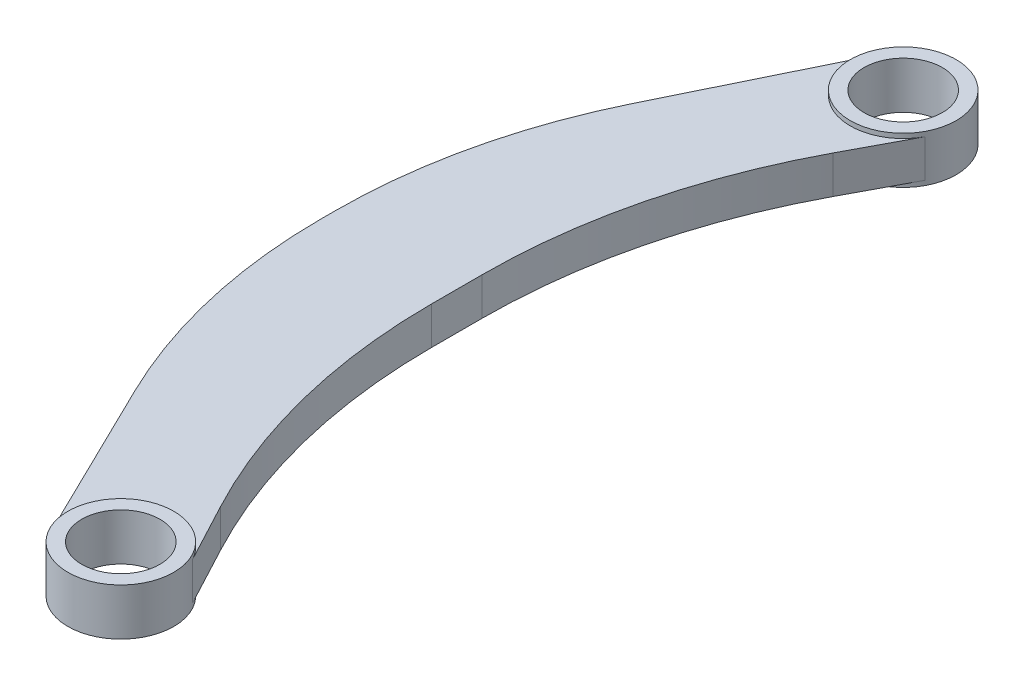
ISO-10303-21;
HEADER;
FILE_DESCRIPTION(('STEP AP214'),'2;1');
FILE_NAME('part.step','',(''),(''),'','','');
FILE_SCHEMA(('AUTOMOTIVE_DESIGN { 1 0 10303 214 1 1 1 1 }'));
ENDSEC;
DATA;
#1=APPLICATION_CONTEXT('core data for automotive mechanical design processes');
#2=APPLICATION_PROTOCOL_DEFINITION('international standard','automotive_design',2000,#1);
#3=PRODUCT_CONTEXT('',#1,'mechanical');
#4=PRODUCT('Part','Part','',(#3));
#5=PRODUCT_RELATED_PRODUCT_CATEGORY('part','',(#4));
#6=PRODUCT_DEFINITION_FORMATION('','',#4);
#7=PRODUCT_DEFINITION_CONTEXT('part definition',#1,'design');
#8=PRODUCT_DEFINITION('design','',#6,#7);
#9=PRODUCT_DEFINITION_SHAPE('','',#8);
#10=(LENGTH_UNIT() NAMED_UNIT(*) SI_UNIT(.MILLI.,.METRE.));
#11=(NAMED_UNIT(*) PLANE_ANGLE_UNIT() SI_UNIT($,.RADIAN.));
#12=(NAMED_UNIT(*) SI_UNIT($,.STERADIAN.) SOLID_ANGLE_UNIT());
#13=UNCERTAINTY_MEASURE_WITH_UNIT(LENGTH_MEASURE(1.E-05),#10,'distance_accuracy_value','');
#14=(GEOMETRIC_REPRESENTATION_CONTEXT(3) GLOBAL_UNCERTAINTY_ASSIGNED_CONTEXT((#13)) GLOBAL_UNIT_ASSIGNED_CONTEXT((#10,
#11,#12)) REPRESENTATION_CONTEXT('',''));
#15=CARTESIAN_POINT('',(0.,0.,0.));
#16=DIRECTION('',(0.,0.,1.));
#17=DIRECTION('',(1.,0.,0.));
#18=AXIS2_PLACEMENT_3D('',#15,#16,#17);
#19=CARTESIAN_POINT('',(-300.00000000003,421.,1299.99999999994));
#20=DIRECTION('',(0.,-1.,0.));
#21=DIRECTION('',(0.,0.,-1.));
#22=AXIS2_PLACEMENT_3D('',#19,#20,#21);
#23=PLANE('',#22);
#24=CARTESIAN_POINT('',(-300.00000000003,421.,1299.99999999994));
#25=DIRECTION('',(0.,-1.,0.));
#26=DIRECTION('',(0.438371146789078,0.,-0.898794046299167));
#27=AXIS2_PLACEMENT_3D('',#24,#25,#26);
#28=CIRCLE('',#27,115.000000000002);
#29=CARTESIAN_POINT('',(-249.587318119285,421.,1196.63868467554));
#30=VERTEX_POINT('',#29);
#31=EDGE_CURVE('E148',#30,#30,#28,.T.);
#32=ORIENTED_EDGE('',*,*,#31,.F.);
#33=EDGE_LOOP('',(#32));
#34=FACE_BOUND('',#33,.T.);
#35=CARTESIAN_POINT('',(-300.00000000003,421.,1299.99999999994));
#36=DIRECTION('',(0.,-1.,0.));
#37=DIRECTION('',(1.,0.,0.));
#38=AXIS2_PLACEMENT_3D('',#35,#36,#37);
#39=CIRCLE('',#38,85.0000000000018);
#40=CARTESIAN_POINT('',(-215.000000000029,421.,1299.99999999994));
#41=VERTEX_POINT('',#40);
#42=EDGE_CURVE('E271',#41,#41,#39,.F.);
#43=ORIENTED_EDGE('',*,*,#42,.F.);
#44=EDGE_LOOP('',(#43));
#45=FACE_BOUND('',#44,.T.);
#46=ADVANCED_FACE('F16',(#34,#45),#23,.F.);
#47=CARTESIAN_POINT('',(-300.00000000003,319.,1299.99999999994));
#48=DIRECTION('',(0.,1.,0.));
#49=DIRECTION('',(0.,0.,1.));
#50=AXIS2_PLACEMENT_3D('',#47,#48,#49);
#51=PLANE('',#50);
#52=CARTESIAN_POINT('',(-300.00000000003,319.,1299.99999999994));
#53=DIRECTION('',(0.,1.,0.));
#54=DIRECTION('',(0.438371146789078,0.,-0.898794046299167));
#55=AXIS2_PLACEMENT_3D('',#52,#53,#54);
#56=CIRCLE('',#55,115.000000000002);
#57=CARTESIAN_POINT('',(-249.587318119285,319.,1196.63868467554));
#58=VERTEX_POINT('',#57);
#59=EDGE_CURVE('E116',#58,#58,#56,.T.);
#60=ORIENTED_EDGE('',*,*,#59,.F.);
#61=EDGE_LOOP('',(#60));
#62=FACE_BOUND('',#61,.T.);
#63=CARTESIAN_POINT('',(-300.00000000003,319.,1299.99999999994));
#64=DIRECTION('',(0.,1.,0.));
#65=DIRECTION('',(-1.,0.,0.));
#66=AXIS2_PLACEMENT_3D('',#63,#64,#65);
#67=CIRCLE('',#66,85.0000000000018);
#68=CARTESIAN_POINT('',(-385.000000000032,319.,1299.99999999994));
#69=VERTEX_POINT('',#68);
#70=EDGE_CURVE('E277',#69,#69,#67,.F.);
#71=ORIENTED_EDGE('',*,*,#70,.F.);
#72=EDGE_LOOP('',(#71));
#73=FACE_BOUND('',#72,.T.);
#74=ADVANCED_FACE('F284',(#62,#73),#51,.F.);
#75=CARTESIAN_POINT('',(-300.00000000003,421.,3000.));
#76=DIRECTION('',(0.,-1.,0.));
#77=DIRECTION('',(0.,0.,-1.));
#78=AXIS2_PLACEMENT_3D('',#75,#76,#77);
#79=PLANE('',#78);
#80=CARTESIAN_POINT('',(-300.00000000003,421.,3000.));
#81=DIRECTION('',(0.,-1.,0.));
#82=DIRECTION('',(0.438371146789078,0.,-0.898794046299167));
#83=AXIS2_PLACEMENT_3D('',#80,#81,#82);
#84=CIRCLE('',#83,115.000000000002);
#85=CARTESIAN_POINT('',(-249.587318119285,421.,2896.63868467559));
#86=VERTEX_POINT('',#85);
#87=EDGE_CURVE('E149',#86,#86,#84,.T.);
#88=ORIENTED_EDGE('',*,*,#87,.F.);
#89=EDGE_LOOP('',(#88));
#90=FACE_BOUND('',#89,.T.);
#91=CARTESIAN_POINT('',(-300.00000000003,421.,3000.));
#92=DIRECTION('',(0.,-1.,0.));
#93=DIRECTION('',(1.,0.,0.));
#94=AXIS2_PLACEMENT_3D('',#91,#92,#93);
#95=CIRCLE('',#94,85.000000000002);
#96=CARTESIAN_POINT('',(-215.000000000028,421.,3000.));
#97=VERTEX_POINT('',#96);
#98=EDGE_CURVE('E117',#97,#97,#95,.F.);
#99=ORIENTED_EDGE('',*,*,#98,.F.);
#100=EDGE_LOOP('',(#99));
#101=FACE_BOUND('',#100,.T.);
#102=ADVANCED_FACE('F286',(#90,#101),#79,.F.);
#103=CARTESIAN_POINT('',(-300.00000000003,319.,3000.));
#104=DIRECTION('',(0.,1.,0.));
#105=DIRECTION('',(0.,0.,1.));
#106=AXIS2_PLACEMENT_3D('',#103,#104,#105);
#107=PLANE('',#106);
#108=CARTESIAN_POINT('',(-300.00000000003,319.,3000.));
#109=DIRECTION('',(0.,1.,0.));
#110=DIRECTION('',(0.438371146789078,0.,-0.898794046299167));
#111=AXIS2_PLACEMENT_3D('',#108,#109,#110);
#112=CIRCLE('',#111,115.000000000002);
#113=CARTESIAN_POINT('',(-249.587318119285,319.,2896.63868467559));
#114=VERTEX_POINT('',#113);
#115=EDGE_CURVE('E260',#114,#114,#112,.T.);
#116=ORIENTED_EDGE('',*,*,#115,.F.);
#117=EDGE_LOOP('',(#116));
#118=FACE_BOUND('',#117,.T.);
#119=CARTESIAN_POINT('',(-300.00000000003,319.,3000.));
#120=DIRECTION('',(0.,1.,0.));
#121=DIRECTION('',(-1.,0.,0.));
#122=AXIS2_PLACEMENT_3D('',#119,#120,#121);
#123=CIRCLE('',#122,85.000000000002);
#124=CARTESIAN_POINT('',(-385.000000000032,319.,3000.));
#125=VERTEX_POINT('',#124);
#126=EDGE_CURVE('E274',#125,#125,#123,.F.);
#127=ORIENTED_EDGE('',*,*,#126,.F.);
#128=EDGE_LOOP('',(#127));
#129=FACE_BOUND('',#128,.T.);
#130=ADVANCED_FACE('F294',(#118,#129),#107,.F.);
#131=CARTESIAN_POINT('',(-300.00000000003,411.,3000.));
#132=DIRECTION('',(0.,1.,0.));
#133=DIRECTION('',(0.,0.,1.));
#134=AXIS2_PLACEMENT_3D('',#131,#132,#133);
#135=PLANE('',#134);
#136=DIRECTION('',(-0.438371146789078,0.,0.898794046299167));
#137=VECTOR('',#136,1.);
#138=CARTESIAN_POINT('',(-403.361315324436,411.,1249.5873181192));
#139=LINE('',#138,#137);
#140=CARTESIAN_POINT('',(-403.361315324436,411.,1249.5873181192));
#141=VERTEX_POINT('',#140);
#142=CARTESIAN_POINT('',(-578.552855559036,411.,1608.78320607439));
#143=VERTEX_POINT('',#142);
#144=EDGE_CURVE('E121',#141,#143,#139,.T.);
#145=ORIENTED_EDGE('',*,*,#144,.T.);
#146=CARTESIAN_POINT('',(499.999999999986,411.,2134.82858222129));
#147=DIRECTION('',(0.,1.,0.));
#148=DIRECTION('',(0.,0.,1.));
#149=AXIS2_PLACEMENT_3D('',#146,#147,#148);
#150=CIRCLE('',#149,1200.00000000002);
#151=CARTESIAN_POINT('',(-700.000000000038,411.,2134.82858222129));
#152=VERTEX_POINT('',#151);
#153=EDGE_CURVE('E10',#143,#152,#150,.T.);
#154=ORIENTED_EDGE('',*,*,#153,.T.);
#155=DIRECTION('',(0.,0.,1.));
#156=VECTOR('',#155,1.);
#157=CARTESIAN_POINT('',(-700.000000000038,411.,1857.78675287061));
#158=LINE('',#157,#156);
#159=CARTESIAN_POINT('',(-700.000000000038,411.,2165.17141777862));
#160=VERTEX_POINT('',#159);
#161=EDGE_CURVE('E158',#152,#160,#158,.T.);
#162=ORIENTED_EDGE('',*,*,#161,.T.);
#163=CARTESIAN_POINT('',(499.999999999986,411.,2165.17141777862));
#164=DIRECTION('',(0.,1.,0.));
#165=DIRECTION('',(0.,0.,1.));
#166=AXIS2_PLACEMENT_3D('',#163,#164,#165);
#167=CIRCLE('',#166,1200.00000000002);
#168=CARTESIAN_POINT('',(-578.552855559036,411.,2691.21679392553));
#169=VERTEX_POINT('',#168);
#170=EDGE_CURVE('E228',#160,#169,#167,.T.);
#171=ORIENTED_EDGE('',*,*,#170,.T.);
#172=DIRECTION('',(0.438371146789078,0.,0.898794046299167));
#173=VECTOR('',#172,1.);
#174=CARTESIAN_POINT('',(-700.000000000038,411.,2442.21324712931));
#175=LINE('',#174,#173);
#176=CARTESIAN_POINT('',(-403.361315324436,411.,3050.41268188072));
#177=VERTEX_POINT('',#176);
#178=EDGE_CURVE('E160',#169,#177,#175,.T.);
#179=ORIENTED_EDGE('',*,*,#178,.T.);
#180=CARTESIAN_POINT('',(-300.00000000003,411.,3000.));
#181=DIRECTION('',(0.,-1.,0.));
#182=DIRECTION('',(0.438371146789078,0.,-0.898794046299167));
#183=AXIS2_PLACEMENT_3D('',#180,#181,#182);
#184=CIRCLE('',#183,115.000000000002);
#185=CARTESIAN_POINT('',(-198.461026821251,411.,2946.0107702796));
#186=VERTEX_POINT('',#185);
#187=EDGE_CURVE('E255',#177,#186,#184,.T.);
#188=ORIENTED_EDGE('',*,*,#187,.T.);
#189=DIRECTION('',(-0.469471562785891,0.,-0.882947592858927));
#190=VECTOR('',#189,1.);
#191=CARTESIAN_POINT('',(-198.461026821251,411.,2946.0107702796));
#192=LINE('',#191,#190);
#193=CARTESIAN_POINT('',(-267.831870716634,411.,2815.54318824215));
#194=VERTEX_POINT('',#193);
#195=EDGE_CURVE('E151',#186,#194,#192,.T.);
#196=ORIENTED_EDGE('',*,*,#195,.T.);
#197=CARTESIAN_POINT('',(880.,411.,2205.23015662047));
#198=DIRECTION('',(0.,1.,0.));
#199=DIRECTION('',(0.,0.,1.));
#200=AXIS2_PLACEMENT_3D('',#197,#198,#199);
#201=CIRCLE('',#200,1300.00000000003);
#202=CARTESIAN_POINT('',(-420.000000000032,411.,2205.23015662047));
#203=VERTEX_POINT('',#202);
#204=EDGE_CURVE('E194',#194,#203,#201,.F.);
#205=ORIENTED_EDGE('',*,*,#204,.T.);
#206=DIRECTION('',(0.,0.,-1.));
#207=VECTOR('',#206,1.);
#208=CARTESIAN_POINT('',(-420.000000000032,411.,2529.35656031662));
#209=LINE('',#208,#207);
#210=CARTESIAN_POINT('',(-420.000000000032,411.,2094.76984337945));
#211=VERTEX_POINT('',#210);
#212=EDGE_CURVE('E154',#203,#211,#209,.T.);
#213=ORIENTED_EDGE('',*,*,#212,.T.);
#214=CARTESIAN_POINT('',(880.,411.,2094.76984337945));
#215=DIRECTION('',(0.,1.,0.));
#216=DIRECTION('',(0.,0.,1.));
#217=AXIS2_PLACEMENT_3D('',#214,#215,#216);
#218=CIRCLE('',#217,1300.00000000003);
#219=CARTESIAN_POINT('',(-267.831870716634,411.,1484.45681175778));
#220=VERTEX_POINT('',#219);
#221=EDGE_CURVE('E217',#211,#220,#218,.F.);
#222=ORIENTED_EDGE('',*,*,#221,.T.);
#223=DIRECTION('',(0.469471562785891,0.,-0.882947592858927));
#224=VECTOR('',#223,1.);
#225=CARTESIAN_POINT('',(-420.000000000032,411.,1770.64343968331));
#226=LINE('',#225,#224);
#227=CARTESIAN_POINT('',(-198.461026821251,411.,1353.98922972032));
#228=VERTEX_POINT('',#227);
#229=EDGE_CURVE('E157',#220,#228,#226,.T.);
#230=ORIENTED_EDGE('',*,*,#229,.T.);
#231=CARTESIAN_POINT('',(-300.00000000003,411.,1299.99999999994));
#232=DIRECTION('',(0.,-1.,0.));
#233=DIRECTION('',(0.438371146789078,0.,-0.898794046299167));
#234=AXIS2_PLACEMENT_3D('',#231,#232,#233);
#235=CIRCLE('',#234,115.000000000002);
#236=EDGE_CURVE('E144',#228,#141,#235,.T.);
#237=ORIENTED_EDGE('',*,*,#236,.T.);
#238=EDGE_LOOP('',(#145,#154,#162,#171,#179,#188,#196,#205,#213,#222,#230,#237));
#239=FACE_BOUND('',#238,.T.);
#240=ADVANCED_FACE('F247',(#239),#135,.T.);
#241=CARTESIAN_POINT('',(-300.00000000003,411.,3000.));
#242=DIRECTION('',(0.,-1.,0.));
#243=DIRECTION('',(0.,0.,-1.));
#244=AXIS2_PLACEMENT_3D('',#241,#242,#243);
#245=CYLINDRICAL_SURFACE('',#244,115.000000000002);
#246=DIRECTION('',(0.,-1.,0.));
#247=VECTOR('',#246,1.);
#248=CARTESIAN_POINT('',(-403.361315324436,411.,3050.41268188072));
#249=LINE('',#248,#247);
#250=CARTESIAN_POINT('',(-403.361315324436,329.,3050.41268188072));
#251=VERTEX_POINT('',#250);
#252=EDGE_CURVE('E122',#177,#251,#249,.T.);
#253=ORIENTED_EDGE('',*,*,#252,.T.);
#254=CARTESIAN_POINT('',(-300.00000000003,329.,3000.));
#255=DIRECTION('',(0.,1.,0.));
#256=DIRECTION('',(0.438371146789078,0.,-0.898794046299167));
#257=AXIS2_PLACEMENT_3D('',#254,#255,#256);
#258=CIRCLE('',#257,115.000000000002);
#259=CARTESIAN_POINT('',(-198.461026821251,329.,2946.0107702796));
#260=VERTEX_POINT('',#259);
#261=EDGE_CURVE('E185',#260,#251,#258,.T.);
#262=ORIENTED_EDGE('',*,*,#261,.F.);
#263=DIRECTION('',(0.,-1.,0.));
#264=VECTOR('',#263,1.);
#265=CARTESIAN_POINT('',(-198.461026821251,411.,2946.0107702796));
#266=LINE('',#265,#264);
#267=EDGE_CURVE('E183',#186,#260,#266,.T.);
#268=ORIENTED_EDGE('',*,*,#267,.F.);
#269=ORIENTED_EDGE('',*,*,#187,.F.);
#270=EDGE_LOOP('',(#253,#262,#268,#269));
#271=FACE_BOUND('',#270,.T.);
#272=ORIENTED_EDGE('',*,*,#87,.T.);
#273=EDGE_LOOP('',(#272));
#274=FACE_BOUND('',#273,.T.);
#275=ORIENTED_EDGE('',*,*,#115,.T.);
#276=EDGE_LOOP('',(#275));
#277=FACE_BOUND('',#276,.T.);
#278=ADVANCED_FACE('F256',(#271,#274,#277),#245,.T.);
#279=CARTESIAN_POINT('',(-198.461026821251,411.,2946.0107702796));
#280=DIRECTION('',(-0.882947592858927,0.,0.469471562785891));
#281=DIRECTION('',(0.469471562785891,0.,0.882947592858927));
#282=AXIS2_PLACEMENT_3D('',#279,#280,#281);
#283=PLANE('',#282);
#284=DIRECTION('',(-0.469471562785891,0.,-0.882947592858927));
#285=VECTOR('',#284,1.);
#286=CARTESIAN_POINT('',(-198.461026821251,329.,2946.0107702796));
#287=LINE('',#286,#285);
#288=CARTESIAN_POINT('',(-267.831870716634,329.,2815.54318824215));
#289=VERTEX_POINT('',#288);
#290=EDGE_CURVE('E163',#260,#289,#287,.T.);
#291=ORIENTED_EDGE('',*,*,#290,.T.);
#292=DIRECTION('',(0.,-1.,0.));
#293=VECTOR('',#292,1.);
#294=CARTESIAN_POINT('',(-267.831870716634,411.,2815.54318824215));
#295=LINE('',#294,#293);
#296=EDGE_CURVE('E190',#289,#194,#295,.F.);
#297=ORIENTED_EDGE('',*,*,#296,.T.);
#298=ORIENTED_EDGE('',*,*,#195,.F.);
#299=ORIENTED_EDGE('',*,*,#267,.T.);
#300=EDGE_LOOP('',(#291,#297,#298,#299));
#301=FACE_BOUND('',#300,.T.);
#302=ADVANCED_FACE('F326',(#301),#283,.F.);
#303=CARTESIAN_POINT('',(-420.000000000032,411.,2529.35656031662));
#304=DIRECTION('',(-1.,0.,0.));
#305=DIRECTION('',(0.,0.,1.));
#306=AXIS2_PLACEMENT_3D('',#303,#304,#305);
#307=PLANE('',#306);
#308=DIRECTION('',(0.,0.,-1.));
#309=VECTOR('',#308,1.);
#310=CARTESIAN_POINT('',(-420.000000000032,329.,2529.35656031662));
#311=LINE('',#310,#309);
#312=CARTESIAN_POINT('',(-420.000000000032,329.,2205.23015662047));
#313=VERTEX_POINT('',#312);
#314=CARTESIAN_POINT('',(-420.000000000032,329.,2094.76984337945));
#315=VERTEX_POINT('',#314);
#316=EDGE_CURVE('E136',#313,#315,#311,.T.);
#317=ORIENTED_EDGE('',*,*,#316,.T.);
#318=DIRECTION('',(0.,-1.,0.));
#319=VECTOR('',#318,1.);
#320=CARTESIAN_POINT('',(-420.000000000032,411.,2094.76984337945));
#321=LINE('',#320,#319);
#322=EDGE_CURVE('E349',#315,#211,#321,.F.);
#323=ORIENTED_EDGE('',*,*,#322,.T.);
#324=ORIENTED_EDGE('',*,*,#212,.F.);
#325=DIRECTION('',(0.,-1.,0.));
#326=VECTOR('',#325,1.);
#327=CARTESIAN_POINT('',(-420.000000000032,329.,2205.23015662047));
#328=LINE('',#327,#326);
#329=EDGE_CURVE('E188',#203,#313,#328,.T.);
#330=ORIENTED_EDGE('',*,*,#329,.T.);
#331=EDGE_LOOP('',(#317,#323,#324,#330));
#332=FACE_BOUND('',#331,.T.);
#333=ADVANCED_FACE('F322',(#332),#307,.F.);
#334=CARTESIAN_POINT('',(-420.000000000032,411.,1770.64343968331));
#335=DIRECTION('',(-0.882947592858927,0.,-0.469471562785891));
#336=DIRECTION('',(-0.469471562785891,0.,0.882947592858927));
#337=AXIS2_PLACEMENT_3D('',#334,#335,#336);
#338=PLANE('',#337);
#339=ORIENTED_EDGE('',*,*,#229,.F.);
#340=DIRECTION('',(0.,-1.,0.));
#341=VECTOR('',#340,1.);
#342=CARTESIAN_POINT('',(-267.831870716634,329.,1484.45681175778));
#343=LINE('',#342,#341);
#344=CARTESIAN_POINT('',(-267.831870716634,329.,1484.45681175778));
#345=VERTEX_POINT('',#344);
#346=EDGE_CURVE('E196',#220,#345,#343,.T.);
#347=ORIENTED_EDGE('',*,*,#346,.T.);
#348=DIRECTION('',(0.469471562785891,0.,-0.882947592858927));
#349=VECTOR('',#348,1.);
#350=CARTESIAN_POINT('',(-420.000000000032,329.,1770.64343968331));
#351=LINE('',#350,#349);
#352=CARTESIAN_POINT('',(-198.461026821251,329.,1353.98922972032));
#353=VERTEX_POINT('',#352);
#354=EDGE_CURVE('E127',#345,#353,#351,.T.);
#355=ORIENTED_EDGE('',*,*,#354,.T.);
#356=DIRECTION('',(0.,-1.,0.));
#357=VECTOR('',#356,1.);
#358=CARTESIAN_POINT('',(-198.461026821251,411.,1353.98922972032));
#359=LINE('',#358,#357);
#360=EDGE_CURVE('E113',#228,#353,#359,.T.);
#361=ORIENTED_EDGE('',*,*,#360,.F.);
#362=EDGE_LOOP('',(#339,#347,#355,#361));
#363=FACE_BOUND('',#362,.T.);
#364=ADVANCED_FACE('F319',(#363),#338,.F.);
#365=CARTESIAN_POINT('',(-300.00000000003,411.,1299.99999999994));
#366=DIRECTION('',(0.,-1.,0.));
#367=DIRECTION('',(0.,0.,-1.));
#368=AXIS2_PLACEMENT_3D('',#365,#366,#367);
#369=CYLINDRICAL_SURFACE('',#368,115.000000000002);
#370=ORIENTED_EDGE('',*,*,#360,.T.);
#371=CARTESIAN_POINT('',(-300.00000000003,329.,1299.99999999994));
#372=DIRECTION('',(0.,1.,0.));
#373=DIRECTION('',(0.438371146789078,0.,-0.898794046299167));
#374=AXIS2_PLACEMENT_3D('',#371,#372,#373);
#375=CIRCLE('',#374,115.000000000002);
#376=CARTESIAN_POINT('',(-403.361315324436,329.,1249.5873181192));
#377=VERTEX_POINT('',#376);
#378=EDGE_CURVE('E105',#377,#353,#375,.T.);
#379=ORIENTED_EDGE('',*,*,#378,.F.);
#380=DIRECTION('',(0.,-1.,0.));
#381=VECTOR('',#380,1.);
#382=CARTESIAN_POINT('',(-403.361315324436,411.,1249.5873181192));
#383=LINE('',#382,#381);
#384=EDGE_CURVE('E110',#141,#377,#383,.T.);
#385=ORIENTED_EDGE('',*,*,#384,.F.);
#386=ORIENTED_EDGE('',*,*,#236,.F.);
#387=EDGE_LOOP('',(#370,#379,#385,#386));
#388=FACE_BOUND('',#387,.T.);
#389=ORIENTED_EDGE('',*,*,#31,.T.);
#390=EDGE_LOOP('',(#389));
#391=FACE_BOUND('',#390,.T.);
#392=ORIENTED_EDGE('',*,*,#59,.T.);
#393=EDGE_LOOP('',(#392));
#394=FACE_BOUND('',#393,.T.);
#395=ADVANCED_FACE('F107',(#388,#391,#394),#369,.T.);
#396=CARTESIAN_POINT('',(-403.361315324436,411.,1249.5873181192));
#397=DIRECTION('',(0.898794046299167,0.,0.438371146789078));
#398=DIRECTION('',(0.438371146789078,0.,-0.898794046299167));
#399=AXIS2_PLACEMENT_3D('',#396,#397,#398);
#400=PLANE('',#399);
#401=DIRECTION('',(-0.438371146789078,0.,0.898794046299167));
#402=VECTOR('',#401,1.);
#403=CARTESIAN_POINT('',(-403.361315324436,329.,1249.5873181192));
#404=LINE('',#403,#402);
#405=CARTESIAN_POINT('',(-578.552855559036,329.,1608.78320607439));
#406=VERTEX_POINT('',#405);
#407=EDGE_CURVE('E120',#377,#406,#404,.T.);
#408=ORIENTED_EDGE('',*,*,#407,.T.);
#409=DIRECTION('',(0.,-1.,0.));
#410=VECTOR('',#409,1.);
#411=CARTESIAN_POINT('',(-578.552855559036,411.,1608.78320607439));
#412=LINE('',#411,#410);
#413=EDGE_CURVE('E24',#406,#143,#412,.F.);
#414=ORIENTED_EDGE('',*,*,#413,.T.);
#415=ORIENTED_EDGE('',*,*,#144,.F.);
#416=ORIENTED_EDGE('',*,*,#384,.T.);
#417=EDGE_LOOP('',(#408,#414,#415,#416));
#418=FACE_BOUND('',#417,.T.);
#419=ADVANCED_FACE('F119',(#418),#400,.F.);
#420=CARTESIAN_POINT('',(-700.000000000038,411.,1857.78675287061));
#421=DIRECTION('',(1.,0.,0.));
#422=DIRECTION('',(0.,0.,-1.));
#423=AXIS2_PLACEMENT_3D('',#420,#421,#422);
#424=PLANE('',#423);
#425=ORIENTED_EDGE('',*,*,#161,.F.);
#426=DIRECTION('',(0.,-1.,0.));
#427=VECTOR('',#426,1.);
#428=CARTESIAN_POINT('',(-700.000000000038,411.,2134.82858222129));
#429=LINE('',#428,#427);
#430=CARTESIAN_POINT('',(-700.000000000038,329.,2134.82858222129));
#431=VERTEX_POINT('',#430);
#432=EDGE_CURVE('E230',#152,#431,#429,.T.);
#433=ORIENTED_EDGE('',*,*,#432,.T.);
#434=DIRECTION('',(0.,0.,1.));
#435=VECTOR('',#434,1.);
#436=CARTESIAN_POINT('',(-700.000000000038,329.,1857.78675287061));
#437=LINE('',#436,#435);
#438=CARTESIAN_POINT('',(-700.000000000038,329.,2165.17141777862));
#439=VERTEX_POINT('',#438);
#440=EDGE_CURVE('E126',#431,#439,#437,.T.);
#441=ORIENTED_EDGE('',*,*,#440,.T.);
#442=DIRECTION('',(0.,-1.,0.));
#443=VECTOR('',#442,1.);
#444=CARTESIAN_POINT('',(-700.000000000038,411.,2165.17141777862));
#445=LINE('',#444,#443);
#446=EDGE_CURVE('E225',#439,#160,#445,.F.);
#447=ORIENTED_EDGE('',*,*,#446,.T.);
#448=EDGE_LOOP('',(#425,#433,#441,#447));
#449=FACE_BOUND('',#448,.T.);
#450=ADVANCED_FACE('F236',(#449),#424,.F.);
#451=CARTESIAN_POINT('',(-700.000000000038,411.,2442.21324712931));
#452=DIRECTION('',(0.898794046299167,0.,-0.438371146789077));
#453=DIRECTION('',(-0.438371146789078,0.,-0.898794046299167));
#454=AXIS2_PLACEMENT_3D('',#451,#452,#453);
#455=PLANE('',#454);
#456=ORIENTED_EDGE('',*,*,#178,.F.);
#457=DIRECTION('',(0.,-1.,0.));
#458=VECTOR('',#457,1.);
#459=CARTESIAN_POINT('',(-578.552855559036,411.,2691.21679392553));
#460=LINE('',#459,#458);
#461=CARTESIAN_POINT('',(-578.552855559036,329.,2691.21679392553));
#462=VERTEX_POINT('',#461);
#463=EDGE_CURVE('E219',#169,#462,#460,.T.);
#464=ORIENTED_EDGE('',*,*,#463,.T.);
#465=DIRECTION('',(0.438371146789078,0.,0.898794046299167));
#466=VECTOR('',#465,1.);
#467=CARTESIAN_POINT('',(-700.000000000038,329.,2442.21324712931));
#468=LINE('',#467,#466);
#469=EDGE_CURVE('E133',#462,#251,#468,.T.);
#470=ORIENTED_EDGE('',*,*,#469,.T.);
#471=ORIENTED_EDGE('',*,*,#252,.F.);
#472=EDGE_LOOP('',(#456,#464,#470,#471));
#473=FACE_BOUND('',#472,.T.);
#474=ADVANCED_FACE('F251',(#473),#455,.F.);
#475=CARTESIAN_POINT('',(-300.00000000003,329.,3000.));
#476=DIRECTION('',(0.,1.,0.));
#477=DIRECTION('',(0.,0.,1.));
#478=AXIS2_PLACEMENT_3D('',#475,#476,#477);
#479=PLANE('',#478);
#480=ORIENTED_EDGE('',*,*,#440,.F.);
#481=CARTESIAN_POINT('',(499.999999999986,329.,2134.82858222129));
#482=DIRECTION('',(0.,1.,0.));
#483=DIRECTION('',(0.,0.,1.));
#484=AXIS2_PLACEMENT_3D('',#481,#482,#483);
#485=CIRCLE('',#484,1200.00000000002);
#486=EDGE_CURVE('E38',#431,#406,#485,.F.);
#487=ORIENTED_EDGE('',*,*,#486,.T.);
#488=ORIENTED_EDGE('',*,*,#407,.F.);
#489=ORIENTED_EDGE('',*,*,#378,.T.);
#490=ORIENTED_EDGE('',*,*,#354,.F.);
#491=CARTESIAN_POINT('',(880.,329.,2094.76984337945));
#492=DIRECTION('',(0.,1.,0.));
#493=DIRECTION('',(0.,0.,1.));
#494=AXIS2_PLACEMENT_3D('',#491,#492,#493);
#495=CIRCLE('',#494,1300.00000000003);
#496=EDGE_CURVE('E348',#345,#315,#495,.T.);
#497=ORIENTED_EDGE('',*,*,#496,.T.);
#498=ORIENTED_EDGE('',*,*,#316,.F.);
#499=CARTESIAN_POINT('',(880.,329.,2205.23015662047));
#500=DIRECTION('',(0.,1.,0.));
#501=DIRECTION('',(0.,0.,1.));
#502=AXIS2_PLACEMENT_3D('',#499,#500,#501);
#503=CIRCLE('',#502,1300.00000000003);
#504=EDGE_CURVE('E192',#313,#289,#503,.T.);
#505=ORIENTED_EDGE('',*,*,#504,.T.);
#506=ORIENTED_EDGE('',*,*,#290,.F.);
#507=ORIENTED_EDGE('',*,*,#261,.T.);
#508=ORIENTED_EDGE('',*,*,#469,.F.);
#509=CARTESIAN_POINT('',(499.999999999986,329.,2165.17141777862));
#510=DIRECTION('',(0.,1.,0.));
#511=DIRECTION('',(0.,0.,1.));
#512=AXIS2_PLACEMENT_3D('',#509,#510,#511);
#513=CIRCLE('',#512,1200.00000000002);
#514=EDGE_CURVE('E222',#462,#439,#513,.F.);
#515=ORIENTED_EDGE('',*,*,#514,.T.);
#516=EDGE_LOOP('',(#480,#487,#488,#489,#490,#497,#498,#505,#506,#507,#508,#515));
#517=FACE_BOUND('',#516,.T.);
#518=ADVANCED_FACE('F124',(#517),#479,.F.);
#519=CARTESIAN_POINT('',(-300.00000000003,63.9999999999966,3000.));
#520=DIRECTION('',(0.,1.,0.));
#521=DIRECTION('',(0.,0.,1.));
#522=AXIS2_PLACEMENT_3D('',#519,#520,#521);
#523=CYLINDRICAL_SURFACE('',#522,85.000000000002);
#524=ORIENTED_EDGE('',*,*,#126,.T.);
#525=EDGE_LOOP('',(#524));
#526=FACE_BOUND('',#525,.T.);
#527=ORIENTED_EDGE('',*,*,#98,.T.);
#528=EDGE_LOOP('',(#527));
#529=FACE_BOUND('',#528,.T.);
#530=ADVANCED_FACE('F302',(#526,#529),#523,.F.);
#531=CARTESIAN_POINT('',(-300.00000000003,63.9999999999966,1299.99999999994));
#532=DIRECTION('',(0.,1.,0.));
#533=DIRECTION('',(0.,0.,1.));
#534=AXIS2_PLACEMENT_3D('',#531,#532,#533);
#535=CYLINDRICAL_SURFACE('',#534,85.0000000000018);
#536=ORIENTED_EDGE('',*,*,#70,.T.);
#537=EDGE_LOOP('',(#536));
#538=FACE_BOUND('',#537,.T.);
#539=ORIENTED_EDGE('',*,*,#42,.T.);
#540=EDGE_LOOP('',(#539));
#541=FACE_BOUND('',#540,.T.);
#542=ADVANCED_FACE('F281',(#538,#541),#535,.F.);
#543=CARTESIAN_POINT('',(880.,411.,2205.23015662047));
#544=DIRECTION('',(0.,1.,0.));
#545=DIRECTION('',(0.,0.,1.));
#546=AXIS2_PLACEMENT_3D('',#543,#544,#545);
#547=CYLINDRICAL_SURFACE('',#546,1300.00000000003);
#548=ORIENTED_EDGE('',*,*,#204,.F.);
#549=ORIENTED_EDGE('',*,*,#296,.F.);
#550=ORIENTED_EDGE('',*,*,#504,.F.);
#551=ORIENTED_EDGE('',*,*,#329,.F.);
#552=EDGE_LOOP('',(#548,#549,#550,#551));
#553=FACE_BOUND('',#552,.T.);
#554=ADVANCED_FACE('F331',(#553),#547,.F.);
#555=CARTESIAN_POINT('',(880.,411.,2094.76984337945));
#556=DIRECTION('',(0.,1.,0.));
#557=DIRECTION('',(0.,0.,1.));
#558=AXIS2_PLACEMENT_3D('',#555,#556,#557);
#559=CYLINDRICAL_SURFACE('',#558,1300.00000000003);
#560=ORIENTED_EDGE('',*,*,#221,.F.);
#561=ORIENTED_EDGE('',*,*,#322,.F.);
#562=ORIENTED_EDGE('',*,*,#496,.F.);
#563=ORIENTED_EDGE('',*,*,#346,.F.);
#564=EDGE_LOOP('',(#560,#561,#562,#563));
#565=FACE_BOUND('',#564,.T.);
#566=ADVANCED_FACE('F334',(#565),#559,.F.);
#567=CARTESIAN_POINT('',(499.999999999986,411.,2165.17141777862));
#568=DIRECTION('',(0.,-1.,0.));
#569=DIRECTION('',(0.,0.,-1.));
#570=AXIS2_PLACEMENT_3D('',#567,#568,#569);
#571=CYLINDRICAL_SURFACE('',#570,1200.00000000002);
#572=ORIENTED_EDGE('',*,*,#170,.F.);
#573=ORIENTED_EDGE('',*,*,#446,.F.);
#574=ORIENTED_EDGE('',*,*,#514,.F.);
#575=ORIENTED_EDGE('',*,*,#463,.F.);
#576=EDGE_LOOP('',(#572,#573,#574,#575));
#577=FACE_BOUND('',#576,.T.);
#578=ADVANCED_FACE('F244',(#577),#571,.T.);
#579=CARTESIAN_POINT('',(499.999999999986,411.,2134.82858222129));
#580=DIRECTION('',(0.,-1.,0.));
#581=DIRECTION('',(0.,0.,-1.));
#582=AXIS2_PLACEMENT_3D('',#579,#580,#581);
#583=CYLINDRICAL_SURFACE('',#582,1200.00000000002);
#584=ORIENTED_EDGE('',*,*,#153,.F.);
#585=ORIENTED_EDGE('',*,*,#413,.F.);
#586=ORIENTED_EDGE('',*,*,#486,.F.);
#587=ORIENTED_EDGE('',*,*,#432,.F.);
#588=EDGE_LOOP('',(#584,#585,#586,#587));
#589=FACE_BOUND('',#588,.T.);
#590=ADVANCED_FACE('F18',(#589),#583,.T.);
#591=CLOSED_SHELL('',(#46,#74,#102,#130,#240,#278,#302,#333,#364,#395,#419,#450,#474,#518,#530,
#542,#554,#566,#578,#590));
#592=MANIFOLD_SOLID_BREP('B1',#591);
#593=ADVANCED_BREP_SHAPE_REPRESENTATION('',(#18,#592),#14);
#594=SHAPE_DEFINITION_REPRESENTATION(#9,#593);
ENDSEC;
END-ISO-10303-21;
